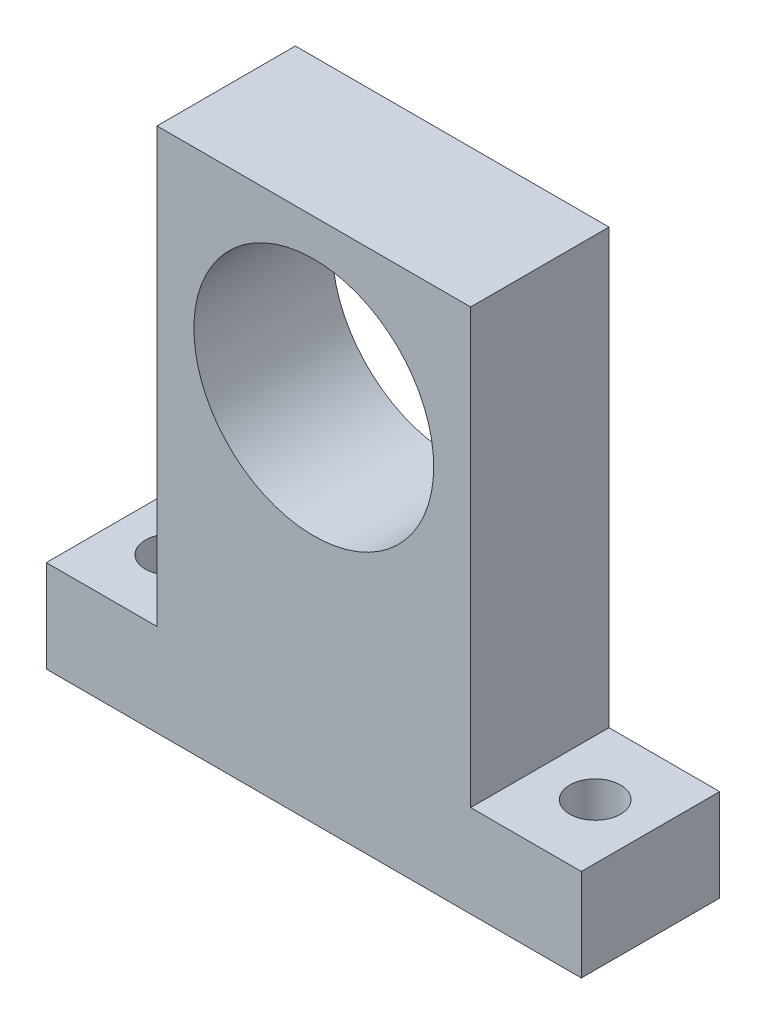
ISO-10303-21;
HEADER;
FILE_DESCRIPTION(('STEP AP214'),'2;1');
FILE_NAME('part.step','',(''),(''),'','','');
FILE_SCHEMA(('AUTOMOTIVE_DESIGN { 1 0 10303 214 1 1 1 1 }'));
ENDSEC;
DATA;
#1=APPLICATION_CONTEXT('core data for automotive mechanical design processes');
#2=APPLICATION_PROTOCOL_DEFINITION('international standard','automotive_design',2000,#1);
#3=PRODUCT_CONTEXT('',#1,'mechanical');
#4=PRODUCT('Part','Part','',(#3));
#5=PRODUCT_RELATED_PRODUCT_CATEGORY('part','',(#4));
#6=PRODUCT_DEFINITION_FORMATION('','',#4);
#7=PRODUCT_DEFINITION_CONTEXT('part definition',#1,'design');
#8=PRODUCT_DEFINITION('design','',#6,#7);
#9=PRODUCT_DEFINITION_SHAPE('','',#8);
#10=(LENGTH_UNIT() NAMED_UNIT(*) SI_UNIT(.MILLI.,.METRE.));
#11=(NAMED_UNIT(*) PLANE_ANGLE_UNIT() SI_UNIT($,.RADIAN.));
#12=(NAMED_UNIT(*) SI_UNIT($,.STERADIAN.) SOLID_ANGLE_UNIT());
#13=UNCERTAINTY_MEASURE_WITH_UNIT(LENGTH_MEASURE(1.E-05),#10,'distance_accuracy_value','');
#14=(GEOMETRIC_REPRESENTATION_CONTEXT(3) GLOBAL_UNCERTAINTY_ASSIGNED_CONTEXT((#13)) GLOBAL_UNIT_ASSIGNED_CONTEXT((#10,
#11,#12)) REPRESENTATION_CONTEXT('',''));
#15=CARTESIAN_POINT('',(0.,0.,0.));
#16=DIRECTION('',(0.,0.,1.));
#17=DIRECTION('',(1.,0.,0.));
#18=AXIS2_PLACEMENT_3D('',#15,#16,#17);
#19=CARTESIAN_POINT('',(0.,0.,15.));
#20=DIRECTION('',(0.,0.,-1.));
#21=DIRECTION('',(-1.,0.,0.));
#22=AXIS2_PLACEMENT_3D('',#19,#20,#21);
#23=PLANE('',#22);
#24=DIRECTION('',(0.,-1.,0.));
#25=VECTOR('',#24,1.);
#26=CARTESIAN_POINT('',(-17.,0.,15.));
#27=LINE('',#26,#25);
#28=CARTESIAN_POINT('',(-17.,0.,15.));
#29=VERTEX_POINT('',#28);
#30=CARTESIAN_POINT('',(-17.,-47.,15.));
#31=VERTEX_POINT('',#30);
#32=EDGE_CURVE('E170',#29,#31,#27,.T.);
#33=ORIENTED_EDGE('',*,*,#32,.T.);
#34=DIRECTION('',(-1.,0.,0.));
#35=VECTOR('',#34,1.);
#36=CARTESIAN_POINT('',(-17.,-47.,15.));
#37=LINE('',#36,#35);
#38=CARTESIAN_POINT('',(-29.,-47.,15.));
#39=VERTEX_POINT('',#38);
#40=EDGE_CURVE('E106',#31,#39,#37,.T.);
#41=ORIENTED_EDGE('',*,*,#40,.T.);
#42=DIRECTION('',(0.,-1.,0.));
#43=VECTOR('',#42,1.);
#44=CARTESIAN_POINT('',(-29.,-47.,15.));
#45=LINE('',#44,#43);
#46=CARTESIAN_POINT('',(-29.,-57.,15.));
#47=VERTEX_POINT('',#46);
#48=EDGE_CURVE('E191',#39,#47,#45,.T.);
#49=ORIENTED_EDGE('',*,*,#48,.T.);
#50=DIRECTION('',(1.,0.,0.));
#51=VECTOR('',#50,1.);
#52=CARTESIAN_POINT('',(-29.,-57.,15.));
#53=LINE('',#52,#51);
#54=CARTESIAN_POINT('',(29.,-57.,15.));
#55=VERTEX_POINT('',#54);
#56=EDGE_CURVE('E205',#47,#55,#53,.T.);
#57=ORIENTED_EDGE('',*,*,#56,.T.);
#58=DIRECTION('',(0.,1.,0.));
#59=VECTOR('',#58,1.);
#60=CARTESIAN_POINT('',(29.,-47.,15.));
#61=LINE('',#60,#59);
#62=CARTESIAN_POINT('',(29.,-47.,15.));
#63=VERTEX_POINT('',#62);
#64=EDGE_CURVE('E125',#55,#63,#61,.T.);
#65=ORIENTED_EDGE('',*,*,#64,.T.);
#66=DIRECTION('',(-1.,0.,0.));
#67=VECTOR('',#66,1.);
#68=CARTESIAN_POINT('',(17.,-47.,15.));
#69=LINE('',#68,#67);
#70=CARTESIAN_POINT('',(17.,-47.,15.));
#71=VERTEX_POINT('',#70);
#72=EDGE_CURVE('E119',#63,#71,#69,.T.);
#73=ORIENTED_EDGE('',*,*,#72,.T.);
#74=DIRECTION('',(0.,1.,0.));
#75=VECTOR('',#74,1.);
#76=CARTESIAN_POINT('',(17.,0.,15.));
#77=LINE('',#76,#75);
#78=CARTESIAN_POINT('',(17.,0.,15.));
#79=VERTEX_POINT('',#78);
#80=EDGE_CURVE('E123',#71,#79,#77,.T.);
#81=ORIENTED_EDGE('',*,*,#80,.T.);
#82=DIRECTION('',(-1.,0.,0.));
#83=VECTOR('',#82,1.);
#84=CARTESIAN_POINT('',(17.,0.,15.));
#85=LINE('',#84,#83);
#86=EDGE_CURVE('E63',#79,#29,#85,.T.);
#87=ORIENTED_EDGE('',*,*,#86,.T.);
#88=EDGE_LOOP('',(#33,#41,#49,#57,#65,#73,#81,#87));
#89=FACE_BOUND('',#88,.T.);
#90=CARTESIAN_POINT('',(0.,-17.,15.));
#91=DIRECTION('',(0.,0.,1.));
#92=DIRECTION('',(1.,0.,0.));
#93=AXIS2_PLACEMENT_3D('',#90,#91,#92);
#94=CIRCLE('',#93,13.);
#95=CARTESIAN_POINT('',(13.,-17.,15.));
#96=VERTEX_POINT('',#95);
#97=EDGE_CURVE('E152',#96,#96,#94,.T.);
#98=ORIENTED_EDGE('',*,*,#97,.F.);
#99=EDGE_LOOP('',(#98));
#100=FACE_BOUND('',#99,.T.);
#101=ADVANCED_FACE('F45',(#89,#100),#23,.F.);
#102=CARTESIAN_POINT('',(0.,0.,0.));
#103=DIRECTION('',(0.,0.,-1.));
#104=DIRECTION('',(-1.,0.,0.));
#105=AXIS2_PLACEMENT_3D('',#102,#103,#104);
#106=PLANE('',#105);
#107=DIRECTION('',(0.,-1.,0.));
#108=VECTOR('',#107,1.);
#109=CARTESIAN_POINT('',(-17.,0.,0.));
#110=LINE('',#109,#108);
#111=CARTESIAN_POINT('',(-17.,0.,0.));
#112=VERTEX_POINT('',#111);
#113=CARTESIAN_POINT('',(-17.,-47.,0.));
#114=VERTEX_POINT('',#113);
#115=EDGE_CURVE('E147',#112,#114,#110,.T.);
#116=ORIENTED_EDGE('',*,*,#115,.F.);
#117=DIRECTION('',(-1.,0.,0.));
#118=VECTOR('',#117,1.);
#119=CARTESIAN_POINT('',(17.,0.,0.));
#120=LINE('',#119,#118);
#121=CARTESIAN_POINT('',(17.,0.,0.));
#122=VERTEX_POINT('',#121);
#123=EDGE_CURVE('E98',#122,#112,#120,.T.);
#124=ORIENTED_EDGE('',*,*,#123,.F.);
#125=DIRECTION('',(0.,1.,0.));
#126=VECTOR('',#125,1.);
#127=CARTESIAN_POINT('',(17.,0.,0.));
#128=LINE('',#127,#126);
#129=CARTESIAN_POINT('',(17.,-47.,0.));
#130=VERTEX_POINT('',#129);
#131=EDGE_CURVE('E92',#130,#122,#128,.T.);
#132=ORIENTED_EDGE('',*,*,#131,.F.);
#133=DIRECTION('',(-1.,0.,0.));
#134=VECTOR('',#133,1.);
#135=CARTESIAN_POINT('',(17.,-47.,0.));
#136=LINE('',#135,#134);
#137=CARTESIAN_POINT('',(29.,-47.,0.));
#138=VERTEX_POINT('',#137);
#139=EDGE_CURVE('E134',#138,#130,#136,.T.);
#140=ORIENTED_EDGE('',*,*,#139,.F.);
#141=DIRECTION('',(0.,1.,0.));
#142=VECTOR('',#141,1.);
#143=CARTESIAN_POINT('',(29.,-47.,0.));
#144=LINE('',#143,#142);
#145=CARTESIAN_POINT('',(29.,-57.,0.));
#146=VERTEX_POINT('',#145);
#147=EDGE_CURVE('E161',#146,#138,#144,.T.);
#148=ORIENTED_EDGE('',*,*,#147,.F.);
#149=DIRECTION('',(1.,0.,0.));
#150=VECTOR('',#149,1.);
#151=CARTESIAN_POINT('',(-29.,-57.,0.));
#152=LINE('',#151,#150);
#153=CARTESIAN_POINT('',(-29.,-57.,0.));
#154=VERTEX_POINT('',#153);
#155=EDGE_CURVE('E158',#154,#146,#152,.T.);
#156=ORIENTED_EDGE('',*,*,#155,.F.);
#157=DIRECTION('',(0.,-1.,0.));
#158=VECTOR('',#157,1.);
#159=CARTESIAN_POINT('',(-29.,-47.,0.));
#160=LINE('',#159,#158);
#161=CARTESIAN_POINT('',(-29.,-47.,0.));
#162=VERTEX_POINT('',#161);
#163=EDGE_CURVE('E155',#162,#154,#160,.T.);
#164=ORIENTED_EDGE('',*,*,#163,.F.);
#165=DIRECTION('',(-1.,0.,0.));
#166=VECTOR('',#165,1.);
#167=CARTESIAN_POINT('',(-17.,-47.,0.));
#168=LINE('',#167,#166);
#169=EDGE_CURVE('E151',#114,#162,#168,.T.);
#170=ORIENTED_EDGE('',*,*,#169,.F.);
#171=EDGE_LOOP('',(#116,#124,#132,#140,#148,#156,#164,#170));
#172=FACE_BOUND('',#171,.T.);
#173=CARTESIAN_POINT('',(0.,-17.,0.));
#174=DIRECTION('',(0.,0.,1.));
#175=DIRECTION('',(1.,0.,0.));
#176=AXIS2_PLACEMENT_3D('',#173,#174,#175);
#177=CIRCLE('',#176,13.);
#178=CARTESIAN_POINT('',(13.,-17.,0.));
#179=VERTEX_POINT('',#178);
#180=EDGE_CURVE('E215',#179,#179,#177,.T.);
#181=ORIENTED_EDGE('',*,*,#180,.T.);
#182=EDGE_LOOP('',(#181));
#183=FACE_BOUND('',#182,.T.);
#184=ADVANCED_FACE('F195',(#172,#183),#106,.T.);
#185=CARTESIAN_POINT('',(-17.,0.,15.));
#186=DIRECTION('',(1.,0.,0.));
#187=DIRECTION('',(0.,1.,0.));
#188=AXIS2_PLACEMENT_3D('',#185,#186,#187);
#189=PLANE('',#188);
#190=ORIENTED_EDGE('',*,*,#115,.T.);
#191=DIRECTION('',(0.,0.,-1.));
#192=VECTOR('',#191,1.);
#193=CARTESIAN_POINT('',(-17.,-47.,15.));
#194=LINE('',#193,#192);
#195=EDGE_CURVE('E11',#31,#114,#194,.T.);
#196=ORIENTED_EDGE('',*,*,#195,.F.);
#197=ORIENTED_EDGE('',*,*,#32,.F.);
#198=DIRECTION('',(0.,0.,-1.));
#199=VECTOR('',#198,1.);
#200=CARTESIAN_POINT('',(-17.,0.,15.));
#201=LINE('',#200,#199);
#202=EDGE_CURVE('E143',#29,#112,#201,.T.);
#203=ORIENTED_EDGE('',*,*,#202,.T.);
#204=EDGE_LOOP('',(#190,#196,#197,#203));
#205=FACE_BOUND('',#204,.T.);
#206=ADVANCED_FACE('F47',(#205),#189,.F.);
#207=CARTESIAN_POINT('',(-17.,-47.,15.));
#208=DIRECTION('',(0.,-1.,0.));
#209=DIRECTION('',(0.,0.,-1.));
#210=AXIS2_PLACEMENT_3D('',#207,#208,#209);
#211=PLANE('',#210);
#212=CARTESIAN_POINT('',(-23.,-47.,7.5));
#213=DIRECTION('',(0.,1.,0.));
#214=DIRECTION('',(0.,0.,1.));
#215=AXIS2_PLACEMENT_3D('',#212,#213,#214);
#216=CIRCLE('',#215,2.75);
#217=CARTESIAN_POINT('',(-23.,-47.,10.25));
#218=VERTEX_POINT('',#217);
#219=EDGE_CURVE('E231',#218,#218,#216,.T.);
#220=ORIENTED_EDGE('',*,*,#219,.F.);
#221=EDGE_LOOP('',(#220));
#222=FACE_BOUND('',#221,.T.);
#223=ORIENTED_EDGE('',*,*,#169,.T.);
#224=DIRECTION('',(0.,0.,-1.));
#225=VECTOR('',#224,1.);
#226=CARTESIAN_POINT('',(-29.,-47.,15.));
#227=LINE('',#226,#225);
#228=EDGE_CURVE('E55',#39,#162,#227,.T.);
#229=ORIENTED_EDGE('',*,*,#228,.F.);
#230=ORIENTED_EDGE('',*,*,#40,.F.);
#231=ORIENTED_EDGE('',*,*,#195,.T.);
#232=EDGE_LOOP('',(#223,#229,#230,#231));
#233=FACE_BOUND('',#232,.T.);
#234=ADVANCED_FACE('F248',(#222,#233),#211,.F.);
#235=CARTESIAN_POINT('',(-29.,-47.,15.));
#236=DIRECTION('',(1.,0.,0.));
#237=DIRECTION('',(0.,0.,-1.));
#238=AXIS2_PLACEMENT_3D('',#235,#236,#237);
#239=PLANE('',#238);
#240=ORIENTED_EDGE('',*,*,#163,.T.);
#241=DIRECTION('',(0.,0.,-1.));
#242=VECTOR('',#241,1.);
#243=CARTESIAN_POINT('',(-29.,-57.,15.));
#244=LINE('',#243,#242);
#245=EDGE_CURVE('E181',#47,#154,#244,.T.);
#246=ORIENTED_EDGE('',*,*,#245,.F.);
#247=ORIENTED_EDGE('',*,*,#48,.F.);
#248=ORIENTED_EDGE('',*,*,#228,.T.);
#249=EDGE_LOOP('',(#240,#246,#247,#248));
#250=FACE_BOUND('',#249,.T.);
#251=ADVANCED_FACE('F189',(#250),#239,.F.);
#252=CARTESIAN_POINT('',(-29.,-57.,15.));
#253=DIRECTION('',(0.,1.,0.));
#254=DIRECTION('',(0.,0.,1.));
#255=AXIS2_PLACEMENT_3D('',#252,#253,#254);
#256=PLANE('',#255);
#257=CARTESIAN_POINT('',(-23.,-57.,7.5));
#258=DIRECTION('',(0.,1.,0.));
#259=DIRECTION('',(0.,0.,1.));
#260=AXIS2_PLACEMENT_3D('',#257,#258,#259);
#261=CIRCLE('',#260,2.75);
#262=CARTESIAN_POINT('',(-23.,-57.,10.25));
#263=VERTEX_POINT('',#262);
#264=EDGE_CURVE('E219',#263,#263,#261,.T.);
#265=ORIENTED_EDGE('',*,*,#264,.T.);
#266=EDGE_LOOP('',(#265));
#267=FACE_BOUND('',#266,.T.);
#268=CARTESIAN_POINT('',(23.,-57.,7.49999999999999));
#269=DIRECTION('',(0.,1.,0.));
#270=DIRECTION('',(0.,0.,-1.));
#271=AXIS2_PLACEMENT_3D('',#268,#269,#270);
#272=CIRCLE('',#271,2.75);
#273=CARTESIAN_POINT('',(23.,-57.,4.74999999999999));
#274=VERTEX_POINT('',#273);
#275=EDGE_CURVE('E223',#274,#274,#272,.T.);
#276=ORIENTED_EDGE('',*,*,#275,.T.);
#277=EDGE_LOOP('',(#276));
#278=FACE_BOUND('',#277,.T.);
#279=ORIENTED_EDGE('',*,*,#155,.T.);
#280=DIRECTION('',(0.,0.,-1.));
#281=VECTOR('',#280,1.);
#282=CARTESIAN_POINT('',(29.,-57.,15.));
#283=LINE('',#282,#281);
#284=EDGE_CURVE('E177',#55,#146,#283,.T.);
#285=ORIENTED_EDGE('',*,*,#284,.F.);
#286=ORIENTED_EDGE('',*,*,#56,.F.);
#287=ORIENTED_EDGE('',*,*,#245,.T.);
#288=EDGE_LOOP('',(#279,#285,#286,#287));
#289=FACE_BOUND('',#288,.T.);
#290=ADVANCED_FACE('F200',(#267,#278,#289),#256,.F.);
#291=CARTESIAN_POINT('',(29.,-47.,15.));
#292=DIRECTION('',(-1.,0.,0.));
#293=DIRECTION('',(0.,0.,1.));
#294=AXIS2_PLACEMENT_3D('',#291,#292,#293);
#295=PLANE('',#294);
#296=ORIENTED_EDGE('',*,*,#147,.T.);
#297=DIRECTION('',(0.,0.,-1.));
#298=VECTOR('',#297,1.);
#299=CARTESIAN_POINT('',(29.,-47.,15.));
#300=LINE('',#299,#298);
#301=EDGE_CURVE('E136',#63,#138,#300,.T.);
#302=ORIENTED_EDGE('',*,*,#301,.F.);
#303=ORIENTED_EDGE('',*,*,#64,.F.);
#304=ORIENTED_EDGE('',*,*,#284,.T.);
#305=EDGE_LOOP('',(#296,#302,#303,#304));
#306=FACE_BOUND('',#305,.T.);
#307=ADVANCED_FACE('F203',(#306),#295,.F.);
#308=CARTESIAN_POINT('',(17.,-47.,15.));
#309=DIRECTION('',(0.,-1.,0.));
#310=DIRECTION('',(0.,0.,-1.));
#311=AXIS2_PLACEMENT_3D('',#308,#309,#310);
#312=PLANE('',#311);
#313=CARTESIAN_POINT('',(23.,-47.,7.49999999999999));
#314=DIRECTION('',(0.,1.,0.));
#315=DIRECTION('',(0.,0.,-1.));
#316=AXIS2_PLACEMENT_3D('',#313,#314,#315);
#317=CIRCLE('',#316,2.75);
#318=CARTESIAN_POINT('',(23.,-47.,4.74999999999999));
#319=VERTEX_POINT('',#318);
#320=EDGE_CURVE('E227',#319,#319,#317,.T.);
#321=ORIENTED_EDGE('',*,*,#320,.F.);
#322=EDGE_LOOP('',(#321));
#323=FACE_BOUND('',#322,.T.);
#324=ORIENTED_EDGE('',*,*,#139,.T.);
#325=DIRECTION('',(0.,0.,-1.));
#326=VECTOR('',#325,1.);
#327=CARTESIAN_POINT('',(17.,-47.,15.));
#328=LINE('',#327,#326);
#329=EDGE_CURVE('E131',#71,#130,#328,.T.);
#330=ORIENTED_EDGE('',*,*,#329,.F.);
#331=ORIENTED_EDGE('',*,*,#72,.F.);
#332=ORIENTED_EDGE('',*,*,#301,.T.);
#333=EDGE_LOOP('',(#324,#330,#331,#332));
#334=FACE_BOUND('',#333,.T.);
#335=ADVANCED_FACE('F132',(#323,#334),#312,.F.);
#336=CARTESIAN_POINT('',(17.,0.,15.));
#337=DIRECTION('',(-1.,0.,0.));
#338=DIRECTION('',(0.,-1.,0.));
#339=AXIS2_PLACEMENT_3D('',#336,#337,#338);
#340=PLANE('',#339);
#341=ORIENTED_EDGE('',*,*,#131,.T.);
#342=DIRECTION('',(0.,0.,-1.));
#343=VECTOR('',#342,1.);
#344=CARTESIAN_POINT('',(17.,0.,15.));
#345=LINE('',#344,#343);
#346=EDGE_CURVE('E137',#79,#122,#345,.T.);
#347=ORIENTED_EDGE('',*,*,#346,.F.);
#348=ORIENTED_EDGE('',*,*,#80,.F.);
#349=ORIENTED_EDGE('',*,*,#329,.T.);
#350=EDGE_LOOP('',(#341,#347,#348,#349));
#351=FACE_BOUND('',#350,.T.);
#352=ADVANCED_FACE('F139',(#351),#340,.F.);
#353=CARTESIAN_POINT('',(17.,0.,15.));
#354=DIRECTION('',(0.,-1.,0.));
#355=DIRECTION('',(0.,0.,-1.));
#356=AXIS2_PLACEMENT_3D('',#353,#354,#355);
#357=PLANE('',#356);
#358=ORIENTED_EDGE('',*,*,#123,.T.);
#359=ORIENTED_EDGE('',*,*,#202,.F.);
#360=ORIENTED_EDGE('',*,*,#86,.F.);
#361=ORIENTED_EDGE('',*,*,#346,.T.);
#362=EDGE_LOOP('',(#358,#359,#360,#361));
#363=FACE_BOUND('',#362,.T.);
#364=ADVANCED_FACE('F253',(#363),#357,.F.);
#365=CARTESIAN_POINT('',(0.,-17.,15.));
#366=DIRECTION('',(0.,0.,-1.));
#367=DIRECTION('',(-1.,0.,0.));
#368=AXIS2_PLACEMENT_3D('',#365,#366,#367);
#369=CYLINDRICAL_SURFACE('',#368,13.);
#370=ORIENTED_EDGE('',*,*,#97,.T.);
#371=EDGE_LOOP('',(#370));
#372=FACE_BOUND('',#371,.T.);
#373=ORIENTED_EDGE('',*,*,#180,.F.);
#374=EDGE_LOOP('',(#373));
#375=FACE_BOUND('',#374,.T.);
#376=ADVANCED_FACE('F255',(#372,#375),#369,.F.);
#377=CARTESIAN_POINT('',(23.,-57.,7.49999999999999));
#378=DIRECTION('',(0.,1.,0.));
#379=DIRECTION('',(0.,0.,1.));
#380=AXIS2_PLACEMENT_3D('',#377,#378,#379);
#381=CYLINDRICAL_SURFACE('',#380,2.75);
#382=ORIENTED_EDGE('',*,*,#275,.F.);
#383=EDGE_LOOP('',(#382));
#384=FACE_BOUND('',#383,.T.);
#385=ORIENTED_EDGE('',*,*,#320,.T.);
#386=EDGE_LOOP('',(#385));
#387=FACE_BOUND('',#386,.T.);
#388=ADVANCED_FACE('F244',(#384,#387),#381,.F.);
#389=CARTESIAN_POINT('',(-23.,-57.,7.5));
#390=DIRECTION('',(0.,1.,0.));
#391=DIRECTION('',(0.,0.,1.));
#392=AXIS2_PLACEMENT_3D('',#389,#390,#391);
#393=CYLINDRICAL_SURFACE('',#392,2.75);
#394=ORIENTED_EDGE('',*,*,#264,.F.);
#395=EDGE_LOOP('',(#394));
#396=FACE_BOUND('',#395,.T.);
#397=ORIENTED_EDGE('',*,*,#219,.T.);
#398=EDGE_LOOP('',(#397));
#399=FACE_BOUND('',#398,.T.);
#400=ADVANCED_FACE('F241',(#396,#399),#393,.F.);
#401=CLOSED_SHELL('',(#101,#184,#206,#234,#251,#290,#307,#335,#352,#364,#376,#388,#400));
#402=MANIFOLD_SOLID_BREP('B2',#401);
#403=ADVANCED_BREP_SHAPE_REPRESENTATION('',(#18,#402),#14);
#404=SHAPE_DEFINITION_REPRESENTATION(#9,#403);
ENDSEC;
END-ISO-10303-21;
